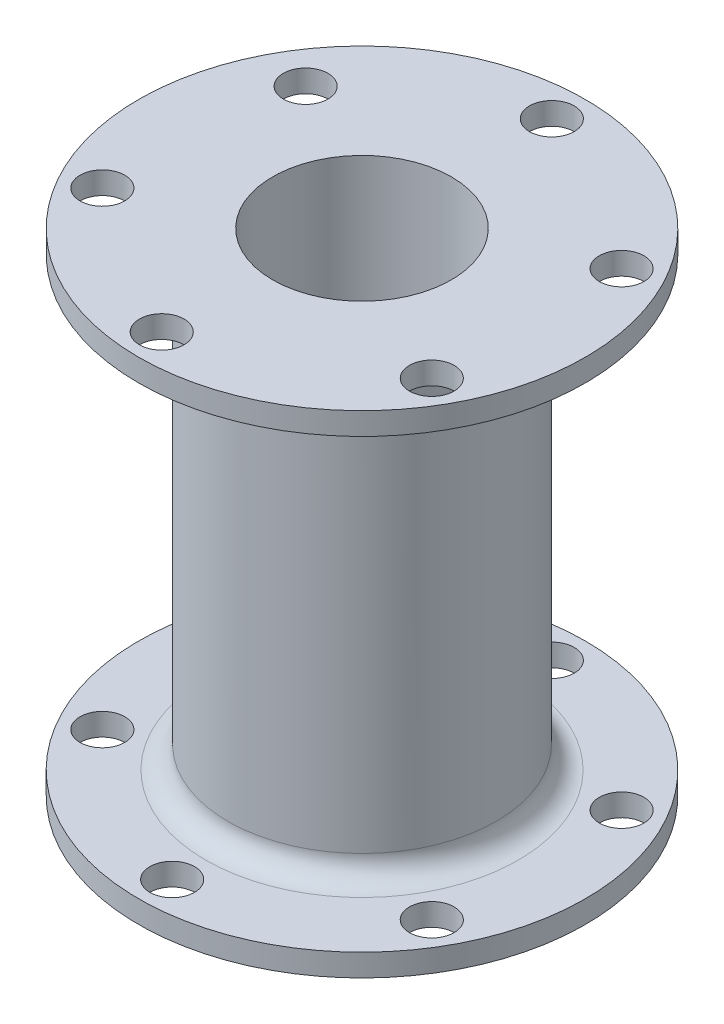
ISO-10303-21;
HEADER;
FILE_DESCRIPTION(('STEP AP214'),'2;1');
FILE_NAME('part.step','',(''),(''),'','','');
FILE_SCHEMA(('AUTOMOTIVE_DESIGN { 1 0 10303 214 1 1 1 1 }'));
ENDSEC;
DATA;
#1=APPLICATION_CONTEXT('core data for automotive mechanical design processes');
#2=APPLICATION_PROTOCOL_DEFINITION('international standard','automotive_design',2000,#1);
#3=PRODUCT_CONTEXT('',#1,'mechanical');
#4=PRODUCT('Part','Part','',(#3));
#5=PRODUCT_RELATED_PRODUCT_CATEGORY('part','',(#4));
#6=PRODUCT_DEFINITION_FORMATION('','',#4);
#7=PRODUCT_DEFINITION_CONTEXT('part definition',#1,'design');
#8=PRODUCT_DEFINITION('design','',#6,#7);
#9=PRODUCT_DEFINITION_SHAPE('','',#8);
#10=(LENGTH_UNIT() NAMED_UNIT(*) SI_UNIT(.MILLI.,.METRE.));
#11=(NAMED_UNIT(*) PLANE_ANGLE_UNIT() SI_UNIT($,.RADIAN.));
#12=(NAMED_UNIT(*) SI_UNIT($,.STERADIAN.) SOLID_ANGLE_UNIT());
#13=UNCERTAINTY_MEASURE_WITH_UNIT(LENGTH_MEASURE(1.E-05),#10,'distance_accuracy_value','');
#14=(GEOMETRIC_REPRESENTATION_CONTEXT(3) GLOBAL_UNCERTAINTY_ASSIGNED_CONTEXT((#13)) GLOBAL_UNIT_ASSIGNED_CONTEXT((#10,
#11,#12)) REPRESENTATION_CONTEXT('',''));
#15=CARTESIAN_POINT('',(0.,0.,0.));
#16=DIRECTION('',(0.,0.,1.));
#17=DIRECTION('',(1.,0.,0.));
#18=AXIS2_PLACEMENT_3D('',#15,#16,#17);
#19=CARTESIAN_POINT('',(0.,12.7,0.));
#20=DIRECTION('',(0.,1.,0.));
#21=DIRECTION('',(0.,0.,1.));
#22=AXIS2_PLACEMENT_3D('',#19,#20,#21);
#23=PLANE('',#22);
#24=CARTESIAN_POINT('',(0.,12.7,-107.95));
#25=DIRECTION('',(0.,1.,0.));
#26=DIRECTION('',(0.,0.,1.));
#27=AXIS2_PLACEMENT_3D('',#24,#25,#26);
#28=CIRCLE('',#27,12.7);
#29=CARTESIAN_POINT('',(0.,12.7,-95.25));
#30=VERTEX_POINT('',#29);
#31=EDGE_CURVE('E172',#30,#30,#28,.T.);
#32=ORIENTED_EDGE('',*,*,#31,.F.);
#33=EDGE_LOOP('',(#32));
#34=FACE_BOUND('',#33,.T.);
#35=CARTESIAN_POINT('',(93.6625,12.7,-53.975));
#36=DIRECTION('',(0.,1.,0.));
#37=DIRECTION('',(0.,0.,1.));
#38=AXIS2_PLACEMENT_3D('',#35,#36,#37);
#39=CIRCLE('',#38,12.7);
#40=CARTESIAN_POINT('',(93.6625,12.7,-41.275));
#41=VERTEX_POINT('',#40);
#42=EDGE_CURVE('E184',#41,#41,#39,.T.);
#43=ORIENTED_EDGE('',*,*,#42,.F.);
#44=EDGE_LOOP('',(#43));
#45=FACE_BOUND('',#44,.T.);
#46=CARTESIAN_POINT('',(-86.0203307345298,12.7,-53.975));
#47=DIRECTION('',(0.,1.,0.));
#48=DIRECTION('',(0.,0.,1.));
#49=AXIS2_PLACEMENT_3D('',#46,#47,#48);
#50=CIRCLE('',#49,12.7);
#51=CARTESIAN_POINT('',(-86.0203307345298,12.7,-41.275));
#52=VERTEX_POINT('',#51);
#53=EDGE_CURVE('E199',#52,#52,#50,.T.);
#54=ORIENTED_EDGE('',*,*,#53,.F.);
#55=EDGE_LOOP('',(#54));
#56=FACE_BOUND('',#55,.T.);
#57=CARTESIAN_POINT('',(-5.93227091070534,12.7,107.95));
#58=DIRECTION('',(0.,1.,0.));
#59=DIRECTION('',(0.,0.,1.));
#60=AXIS2_PLACEMENT_3D('',#57,#58,#59);
#61=CIRCLE('',#60,12.7);
#62=CARTESIAN_POINT('',(-5.93227091070534,12.7,120.65));
#63=VERTEX_POINT('',#62);
#64=EDGE_CURVE('E190',#63,#63,#61,.T.);
#65=ORIENTED_EDGE('',*,*,#64,.F.);
#66=EDGE_LOOP('',(#65));
#67=FACE_BOUND('',#66,.T.);
#68=CARTESIAN_POINT('',(-93.6625,12.7,53.975));
#69=DIRECTION('',(0.,1.,0.));
#70=DIRECTION('',(0.,0.,1.));
#71=AXIS2_PLACEMENT_3D('',#68,#69,#70);
#72=CIRCLE('',#71,12.7);
#73=CARTESIAN_POINT('',(-93.6625,12.7,66.675));
#74=VERTEX_POINT('',#73);
#75=EDGE_CURVE('E191',#74,#74,#72,.T.);
#76=ORIENTED_EDGE('',*,*,#75,.F.);
#77=EDGE_LOOP('',(#76));
#78=FACE_BOUND('',#77,.T.);
#79=CARTESIAN_POINT('',(93.6625,12.7,53.975));
#80=DIRECTION('',(0.,1.,0.));
#81=DIRECTION('',(0.,0.,1.));
#82=AXIS2_PLACEMENT_3D('',#79,#80,#81);
#83=CIRCLE('',#82,12.7);
#84=CARTESIAN_POINT('',(93.6625,12.7,66.675));
#85=VERTEX_POINT('',#84);
#86=EDGE_CURVE('E183',#85,#85,#83,.T.);
#87=ORIENTED_EDGE('',*,*,#86,.F.);
#88=EDGE_LOOP('',(#87));
#89=FACE_BOUND('',#88,.T.);
#90=CARTESIAN_POINT('',(0.,12.7,0.));
#91=DIRECTION('',(0.,1.,0.));
#92=DIRECTION('',(0.,0.,1.));
#93=AXIS2_PLACEMENT_3D('',#90,#91,#92);
#94=CIRCLE('',#93,127.);
#95=CARTESIAN_POINT('',(0.,12.7,127.));
#96=VERTEX_POINT('',#95);
#97=EDGE_CURVE('E83',#96,#96,#94,.T.);
#98=ORIENTED_EDGE('',*,*,#97,.T.);
#99=EDGE_LOOP('',(#98));
#100=FACE_BOUND('',#99,.T.);
#101=CARTESIAN_POINT('',(0.,12.7,0.));
#102=DIRECTION('',(0.,1.,0.));
#103=DIRECTION('',(0.,0.,1.));
#104=AXIS2_PLACEMENT_3D('',#101,#102,#103);
#105=CIRCLE('',#104,50.8);
#106=CARTESIAN_POINT('',(0.,12.7,50.8));
#107=VERTEX_POINT('',#106);
#108=EDGE_CURVE('E174',#107,#107,#105,.T.);
#109=ORIENTED_EDGE('',*,*,#108,.F.);
#110=EDGE_LOOP('',(#109));
#111=FACE_BOUND('',#110,.T.);
#112=ADVANCED_FACE('F41',(#34,#45,#56,#67,#78,#89,#100,#111),#23,.T.);
#113=CARTESIAN_POINT('',(0.,0.,0.));
#114=DIRECTION('',(0.,1.,0.));
#115=DIRECTION('',(0.,0.,1.));
#116=AXIS2_PLACEMENT_3D('',#113,#114,#115);
#117=PLANE('',#116);
#118=CARTESIAN_POINT('',(0.,0.,-107.95));
#119=DIRECTION('',(0.,1.,0.));
#120=DIRECTION('',(0.,0.,1.));
#121=AXIS2_PLACEMENT_3D('',#118,#119,#120);
#122=CIRCLE('',#121,12.7);
#123=CARTESIAN_POINT('',(0.,0.,-95.25));
#124=VERTEX_POINT('',#123);
#125=EDGE_CURVE('E170',#124,#124,#122,.T.);
#126=ORIENTED_EDGE('',*,*,#125,.T.);
#127=EDGE_LOOP('',(#126));
#128=FACE_BOUND('',#127,.T.);
#129=CARTESIAN_POINT('',(93.6625,0.,-53.975));
#130=DIRECTION('',(0.,1.,0.));
#131=DIRECTION('',(0.,0.,1.));
#132=AXIS2_PLACEMENT_3D('',#129,#130,#131);
#133=CIRCLE('',#132,12.7);
#134=CARTESIAN_POINT('',(93.6625,0.,-41.275));
#135=VERTEX_POINT('',#134);
#136=EDGE_CURVE('E180',#135,#135,#133,.T.);
#137=ORIENTED_EDGE('',*,*,#136,.T.);
#138=EDGE_LOOP('',(#137));
#139=FACE_BOUND('',#138,.T.);
#140=CARTESIAN_POINT('',(-86.0203307345298,0.,-53.975));
#141=DIRECTION('',(0.,1.,0.));
#142=DIRECTION('',(0.,0.,1.));
#143=AXIS2_PLACEMENT_3D('',#140,#141,#142);
#144=CIRCLE('',#143,12.7);
#145=CARTESIAN_POINT('',(-74.7494536763627,0.,-48.1220238049617));
#146=VERTEX_POINT('',#145);
#147=CARTESIAN_POINT('',(-75.8471951227985,0.,-46.3725456709477));
#148=VERTEX_POINT('',#147);
#149=EDGE_CURVE('E176',#146,#148,#144,.T.);
#150=ORIENTED_EDGE('',*,*,#149,.T.);
#151=CARTESIAN_POINT('',(0.,0.,0.));
#152=DIRECTION('',(0.,1.,0.));
#153=DIRECTION('',(0.,0.,1.));
#154=AXIS2_PLACEMENT_3D('',#151,#152,#153);
#155=CIRCLE('',#154,88.9);
#156=EDGE_CURVE('E55',#148,#146,#155,.T.);
#157=ORIENTED_EDGE('',*,*,#156,.T.);
#158=EDGE_LOOP('',(#150,#157));
#159=FACE_BOUND('',#158,.T.);
#160=CARTESIAN_POINT('',(-5.93227091070534,0.,107.95));
#161=DIRECTION('',(0.,1.,0.));
#162=DIRECTION('',(0.,0.,1.));
#163=AXIS2_PLACEMENT_3D('',#160,#161,#162);
#164=CIRCLE('',#163,12.7);
#165=CARTESIAN_POINT('',(-5.93227091070534,0.,120.65));
#166=VERTEX_POINT('',#165);
#167=EDGE_CURVE('E202',#166,#166,#164,.T.);
#168=ORIENTED_EDGE('',*,*,#167,.T.);
#169=EDGE_LOOP('',(#168));
#170=FACE_BOUND('',#169,.T.);
#171=CARTESIAN_POINT('',(-93.6625,0.,53.975));
#172=DIRECTION('',(0.,1.,0.));
#173=DIRECTION('',(0.,0.,1.));
#174=AXIS2_PLACEMENT_3D('',#171,#172,#173);
#175=CIRCLE('',#174,12.7);
#176=CARTESIAN_POINT('',(-93.6625,0.,66.675));
#177=VERTEX_POINT('',#176);
#178=EDGE_CURVE('E187',#177,#177,#175,.T.);
#179=ORIENTED_EDGE('',*,*,#178,.T.);
#180=EDGE_LOOP('',(#179));
#181=FACE_BOUND('',#180,.T.);
#182=CARTESIAN_POINT('',(93.6625,0.,53.975));
#183=DIRECTION('',(0.,1.,0.));
#184=DIRECTION('',(0.,0.,1.));
#185=AXIS2_PLACEMENT_3D('',#182,#183,#184);
#186=CIRCLE('',#185,12.7);
#187=CARTESIAN_POINT('',(93.6625,0.,66.675));
#188=VERTEX_POINT('',#187);
#189=EDGE_CURVE('E194',#188,#188,#186,.T.);
#190=ORIENTED_EDGE('',*,*,#189,.T.);
#191=EDGE_LOOP('',(#190));
#192=FACE_BOUND('',#191,.T.);
#193=CARTESIAN_POINT('',(0.,0.,0.));
#194=DIRECTION('',(0.,1.,0.));
#195=DIRECTION('',(0.,0.,1.));
#196=AXIS2_PLACEMENT_3D('',#193,#194,#195);
#197=CIRCLE('',#196,127.);
#198=CARTESIAN_POINT('',(0.,0.,127.));
#199=VERTEX_POINT('',#198);
#200=EDGE_CURVE('E209',#199,#199,#197,.T.);
#201=ORIENTED_EDGE('',*,*,#200,.F.);
#202=EDGE_LOOP('',(#201));
#203=FACE_BOUND('',#202,.T.);
#204=ADVANCED_FACE('F129',(#128,#139,#159,#170,#181,#192,#203),#117,.F.);
#205=CARTESIAN_POINT('',(0.,12.7,0.));
#206=DIRECTION('',(0.,-1.,0.));
#207=DIRECTION('',(0.,0.,-1.));
#208=AXIS2_PLACEMENT_3D('',#205,#206,#207);
#209=CYLINDRICAL_SURFACE('',#208,127.);
#210=ORIENTED_EDGE('',*,*,#97,.F.);
#211=EDGE_LOOP('',(#210));
#212=FACE_BOUND('',#211,.T.);
#213=ORIENTED_EDGE('',*,*,#200,.T.);
#214=EDGE_LOOP('',(#213));
#215=FACE_BOUND('',#214,.T.);
#216=ADVANCED_FACE('F101',(#212,#215),#209,.T.);
#217=CARTESIAN_POINT('',(0.,12.7,0.));
#218=DIRECTION('',(0.,-1.,0.));
#219=DIRECTION('',(0.,0.,-1.));
#220=AXIS2_PLACEMENT_3D('',#217,#218,#219);
#221=CYLINDRICAL_SURFACE('',#220,50.8);
#222=ORIENTED_EDGE('',*,*,#108,.T.);
#223=EDGE_LOOP('',(#222));
#224=FACE_BOUND('',#223,.T.);
#225=CARTESIAN_POINT('',(0.,-266.7,0.));
#226=DIRECTION('',(0.,-1.,0.));
#227=DIRECTION('',(0.,0.,-1.));
#228=AXIS2_PLACEMENT_3D('',#225,#226,#227);
#229=CIRCLE('',#228,50.8);
#230=CARTESIAN_POINT('',(0.,-266.7,-50.8));
#231=VERTEX_POINT('',#230);
#232=EDGE_CURVE('E226',#231,#231,#229,.T.);
#233=ORIENTED_EDGE('',*,*,#232,.T.);
#234=EDGE_LOOP('',(#233));
#235=FACE_BOUND('',#234,.T.);
#236=ADVANCED_FACE('F139',(#224,#235),#221,.F.);
#237=CARTESIAN_POINT('',(93.6625,0.,53.975));
#238=DIRECTION('',(0.,1.,0.));
#239=DIRECTION('',(0.,0.,1.));
#240=AXIS2_PLACEMENT_3D('',#237,#238,#239);
#241=CYLINDRICAL_SURFACE('',#240,12.7);
#242=ORIENTED_EDGE('',*,*,#189,.F.);
#243=EDGE_LOOP('',(#242));
#244=FACE_BOUND('',#243,.T.);
#245=ORIENTED_EDGE('',*,*,#86,.T.);
#246=EDGE_LOOP('',(#245));
#247=FACE_BOUND('',#246,.T.);
#248=ADVANCED_FACE('F143',(#244,#247),#241,.F.);
#249=CARTESIAN_POINT('',(-93.6625,0.,53.975));
#250=DIRECTION('',(0.,1.,0.));
#251=DIRECTION('',(0.,0.,1.));
#252=AXIS2_PLACEMENT_3D('',#249,#250,#251);
#253=CYLINDRICAL_SURFACE('',#252,12.7);
#254=ORIENTED_EDGE('',*,*,#178,.F.);
#255=EDGE_LOOP('',(#254));
#256=FACE_BOUND('',#255,.T.);
#257=ORIENTED_EDGE('',*,*,#75,.T.);
#258=EDGE_LOOP('',(#257));
#259=FACE_BOUND('',#258,.T.);
#260=ADVANCED_FACE('F148',(#256,#259),#253,.F.);
#261=CARTESIAN_POINT('',(-5.93227091070534,0.,107.95));
#262=DIRECTION('',(0.,1.,0.));
#263=DIRECTION('',(0.,0.,1.));
#264=AXIS2_PLACEMENT_3D('',#261,#262,#263);
#265=CYLINDRICAL_SURFACE('',#264,12.7);
#266=ORIENTED_EDGE('',*,*,#167,.F.);
#267=EDGE_LOOP('',(#266));
#268=FACE_BOUND('',#267,.T.);
#269=ORIENTED_EDGE('',*,*,#64,.T.);
#270=EDGE_LOOP('',(#269));
#271=FACE_BOUND('',#270,.T.);
#272=ADVANCED_FACE('F145',(#268,#271),#265,.F.);
#273=CARTESIAN_POINT('',(-86.0203307345298,0.,-53.975));
#274=DIRECTION('',(0.,1.,0.));
#275=DIRECTION('',(0.,0.,1.));
#276=AXIS2_PLACEMENT_3D('',#273,#274,#275);
#277=CYLINDRICAL_SURFACE('',#276,12.7);
#278=EDGE_CURVE('E76',#148,#146,#144,.T.);
#279=ORIENTED_EDGE('',*,*,#278,.F.);
#280=ORIENTED_EDGE('',*,*,#149,.F.);
#281=EDGE_LOOP('',(#279,#280));
#282=FACE_BOUND('',#281,.T.);
#283=ORIENTED_EDGE('',*,*,#53,.T.);
#284=EDGE_LOOP('',(#283));
#285=FACE_BOUND('',#284,.T.);
#286=ADVANCED_FACE('F147',(#282,#285),#277,.F.);
#287=CARTESIAN_POINT('',(93.6625,0.,-53.975));
#288=DIRECTION('',(0.,1.,0.));
#289=DIRECTION('',(0.,0.,1.));
#290=AXIS2_PLACEMENT_3D('',#287,#288,#289);
#291=CYLINDRICAL_SURFACE('',#290,12.7);
#292=ORIENTED_EDGE('',*,*,#136,.F.);
#293=EDGE_LOOP('',(#292));
#294=FACE_BOUND('',#293,.T.);
#295=ORIENTED_EDGE('',*,*,#42,.T.);
#296=EDGE_LOOP('',(#295));
#297=FACE_BOUND('',#296,.T.);
#298=ADVANCED_FACE('F153',(#294,#297),#291,.F.);
#299=CARTESIAN_POINT('',(0.,0.,-107.95));
#300=DIRECTION('',(0.,1.,0.));
#301=DIRECTION('',(0.,0.,1.));
#302=AXIS2_PLACEMENT_3D('',#299,#300,#301);
#303=CYLINDRICAL_SURFACE('',#302,12.7);
#304=ORIENTED_EDGE('',*,*,#125,.F.);
#305=EDGE_LOOP('',(#304));
#306=FACE_BOUND('',#305,.T.);
#307=ORIENTED_EDGE('',*,*,#31,.T.);
#308=EDGE_LOOP('',(#307));
#309=FACE_BOUND('',#308,.T.);
#310=ADVANCED_FACE('F126',(#306,#309),#303,.F.);
#311=CARTESIAN_POINT('',(0.,-254.,0.));
#312=DIRECTION('',(0.,1.,0.));
#313=DIRECTION('',(0.,0.,1.));
#314=AXIS2_PLACEMENT_3D('',#311,#312,#313);
#315=CYLINDRICAL_SURFACE('',#314,76.2);
#316=CARTESIAN_POINT('',(0.,-241.3,0.));
#317=DIRECTION('',(0.,-1.,0.));
#318=DIRECTION('',(0.,0.,-1.));
#319=AXIS2_PLACEMENT_3D('',#316,#317,#318);
#320=CIRCLE('',#319,76.2);
#321=CARTESIAN_POINT('',(0.,-241.3,-76.2));
#322=VERTEX_POINT('',#321);
#323=EDGE_CURVE('E12',#322,#322,#320,.F.);
#324=ORIENTED_EDGE('',*,*,#323,.T.);
#325=EDGE_LOOP('',(#324));
#326=FACE_BOUND('',#325,.T.);
#327=CARTESIAN_POINT('',(0.,-12.7,0.));
#328=DIRECTION('',(0.,1.,0.));
#329=DIRECTION('',(0.,0.,1.));
#330=AXIS2_PLACEMENT_3D('',#327,#328,#329);
#331=CIRCLE('',#330,76.2);
#332=CARTESIAN_POINT('',(-64.0709602940252,-12.7,-41.2474489756815));
#333=VERTEX_POINT('',#332);
#334=CARTESIAN_POINT('',(-65.0118815338273,-12.7,-39.7478962893838));
#335=VERTEX_POINT('',#334);
#336=EDGE_CURVE('E80',#333,#335,#331,.F.);
#337=ORIENTED_EDGE('',*,*,#336,.T.);
#338=CARTESIAN_POINT('',(-66.3922054172742,-12.6790344130905,-37.3967252554346));
#339=CARTESIAN_POINT('',(-66.2566760114508,0.718416275781455,-37.637337129604));
#340=CARTESIAN_POINT('',(-77.9226732737142,0.,-44.1914452448357));
#341=CARTESIAN_POINT('',(-66.3363018171941,-12.6817729086105,-37.4959736277565));
#342=CARTESIAN_POINT('',(-66.2135987618936,0.672224703842054,-37.7129761954845));
#343=CARTESIAN_POINT('',(-77.8322874908656,0.,-44.2662532685392));
#344=CARTESIAN_POINT('',(-66.2801727097247,-12.6841292861744,-37.5951018579314));
#345=CARTESIAN_POINT('',(-66.1691145303424,0.627741419865773,-37.790832487182));
#346=CARTESIAN_POINT('',(-77.7418888755431,0.,-44.3431881989159));
#347=CARTESIAN_POINT('',(-66.1674667495949,-12.6881993651497,-37.7931120859876));
#348=CARTESIAN_POINT('',(-66.0776409840994,0.542600586077002,-37.9503113353694));
#349=CARTESIAN_POINT('',(-77.5614127441039,0.,-44.5012946588715));
#350=CARTESIAN_POINT('',(-66.1108899009723,-12.6899130723502,-37.8919940860789));
#351=CARTESIAN_POINT('',(-66.0306485348425,0.501920331039952,-38.0319412888461));
#352=CARTESIAN_POINT('',(-77.4713352251022,0.,-44.5824661502805));
#353=CARTESIAN_POINT('',(-65.9404949447733,-12.6942724892202,-38.1882578669827));
#354=CARTESIAN_POINT('',(-65.8863429733826,0.386091425728664,-38.2815502374763));
#355=CARTESIAN_POINT('',(-77.2021080279843,0.,-44.8323061324113));
#356=CARTESIAN_POINT('',(-65.8260086727109,-12.6961366617123,-38.385264093375));
#357=CARTESIAN_POINT('',(-65.7852373693161,0.316679555883295,-38.4550633598136));
#358=CARTESIAN_POINT('',(-77.0239575941263,0.,-45.0073051564307));
#359=CARTESIAN_POINT('',(-65.5952933710487,-12.6986285437142,-38.7782076346673));
#360=CARTESIAN_POINT('',(-65.5750756853083,0.195339026706855,-38.8122837108383));
#361=CARTESIAN_POINT('',(-76.6732914294015,0.,-45.3734256538379));
#362=CARTESIAN_POINT('',(-65.4790646713201,-12.6992564843582,-38.9741451425491));
#363=CARTESIAN_POINT('',(-65.4659284691607,0.143250680050112,-38.9961619494216));
#364=CARTESIAN_POINT('',(-76.500774651162,0.,-45.5645441064609));
#365=CARTESIAN_POINT('',(-65.2448533321656,-12.6999429224291,-39.364971917946));
#366=CARTESIAN_POINT('',(-65.2413845645419,0.0574434129555664,-39.3706640270329));
#367=CARTESIAN_POINT('',(-76.1642981682024,0.,-45.9614927762687));
#368=CARTESIAN_POINT('',(-65.1268706777553,-12.7000014149883,-39.5598611764864));
#369=CARTESIAN_POINT('',(-65.1258546883355,0.0236044005259853,-39.561522260085));
#370=CARTESIAN_POINT('',(-76.0003385366412,0.,-46.1673231191963));
#371=CARTESIAN_POINT('',(-64.8893983223144,-12.699998539859,-39.9481874444302));
#372=CARTESIAN_POINT('',(-64.8907142952889,-0.025101505925123,-39.9460358120175));
#373=CARTESIAN_POINT('',(-75.6840660212888,0.,-46.5911396022112));
#374=CARTESIAN_POINT('',(-64.7699120810946,-12.6999374100713,-40.1416265698233));
#375=CARTESIAN_POINT('',(-64.7709493748268,-0.0400775229843868,-40.1399587063546));
#376=CARTESIAN_POINT('',(-75.5317306455671,0.,-46.8091007794003));
#377=CARTESIAN_POINT('',(-64.5292132664934,-12.6998981363971,-40.5274268791216));
#378=CARTESIAN_POINT('',(-64.5292214404825,-0.0509739250586011,-40.527419028813));
#379=CARTESIAN_POINT('',(-75.2407156894592,0.,-47.2548261611453));
#380=CARTESIAN_POINT('',(-64.4080006990769,-12.6999199922239,-40.7197880667483));
#381=CARTESIAN_POINT('',(-64.4070776089387,-0.0469107733609275,-40.721247981808));
#382=CARTESIAN_POINT('',(-75.1020360619011,0.,-47.4825903318341));
#383=CARTESIAN_POINT('',(-64.1638368989692,-12.6999915259115,-41.1034517656081));
#384=CARTESIAN_POINT('',(-64.1627921085284,-0.0198544392725567,-41.1050840430494));
#385=CARTESIAN_POINT('',(-74.840111677896,0.,-47.9448024730881));
#386=CARTESIAN_POINT('',(-64.0408853615236,-12.7000412087094,-41.294754082892));
#387=CARTESIAN_POINT('',(-64.0404678551706,0.00318258108777111,-41.2953732755222));
#388=CARTESIAN_POINT('',(-74.7168696651448,0.,-48.1792516226969));
#389=CARTESIAN_POINT('',(-63.7932740463723,-12.6998590796836,-41.6762510241735));
#390=CARTESIAN_POINT('',(-63.7981359808467,0.0677329803441533,-41.6687843230006));
#391=CARTESIAN_POINT('',(-74.4869721055512,0.,-48.6514108941366));
#392=CARTESIAN_POINT('',(-63.6686142623808,-12.6996272668239,-41.8664456440914));
#393=CARTESIAN_POINT('',(-63.6779605638811,0.10933965462767,-41.8521555387905));
#394=CARTESIAN_POINT('',(-74.3803166197597,0.,-48.8891210279669));
#395=CARTESIAN_POINT('',(-63.4174026794564,-12.6983380926377,-42.2460046708477));
#396=CARTESIAN_POINT('',(-63.4420525066568,0.21032300017279,-42.2089304847803));
#397=CARTESIAN_POINT('',(-74.1838468846344,0.,-49.3647950440976));
#398=CARTESIAN_POINT('',(-63.2908482435028,-12.697279450135,-42.4353673302403));
#399=CARTESIAN_POINT('',(-63.3261893744829,0.269863933427487,-42.3825136631104));
#400=CARTESIAN_POINT('',(-74.0940590398643,0.,-49.6027587473585));
#401=CARTESIAN_POINT('',(-63.0360515893977,-12.693588039505,-42.8129427914761));
#402=CARTESIAN_POINT('',(-63.1013920282846,0.405573993398289,-42.7166019980957));
#403=CARTESIAN_POINT('',(-73.9312604763514,0.,-50.0754004123108));
#404=CARTESIAN_POINT('',(-62.9078093791008,-12.6909552787008,-43.0011555986646));
#405=CARTESIAN_POINT('',(-62.9923614492995,0.481910226201257,-42.8772358165688));
#406=CARTESIAN_POINT('',(-73.8582496795608,0.,-50.3100783892829));
#407=CARTESIAN_POINT('',(-62.6497087097746,-12.6832100255491,-43.3763278757359));
#408=CARTESIAN_POINT('',(-62.7834806328776,0.649728203162697,-43.1829003653382));
#409=CARTESIAN_POINT('',(-73.7281856407773,0.,-50.7732758897234));
#410=CARTESIAN_POINT('',(-62.5198508953586,-12.6780984931342,-43.5632878024192));
#411=CARTESIAN_POINT('',(-62.6835802435787,0.741385245491094,-43.3279914822407));
#412=CARTESIAN_POINT('',(-73.6711262349008,0.,-51.0017977610821));
#413=CARTESIAN_POINT('',(-62.2585105061954,-12.6643746149944,-43.9359723427));
#414=CARTESIAN_POINT('',(-62.49500732905,0.938078425492645,-43.6005392264234));
#415=CARTESIAN_POINT('',(-73.5716522165493,0.,-51.4504756320254));
#416=CARTESIAN_POINT('',(-62.1270279668431,-12.6557623454043,-44.1216969830735));
#417=CARTESIAN_POINT('',(-62.4063410320817,1.04329238182593,-43.7279765185214));
#418=CARTESIAN_POINT('',(-73.5292372856207,0.,-51.6706318134346));
#419=CARTESIAN_POINT('',(-61.8621882686278,-12.6339166711158,-44.4922649956994));
#420=CARTESIAN_POINT('',(-62.2419837175014,1.26523543062939,-43.9637803266469));
#421=CARTESIAN_POINT('',(-73.4574065623682,0.,-52.101306267635));
#422=CARTESIAN_POINT('',(-61.7288274607604,-12.6206725642652,-44.6771053133056));
#423=CARTESIAN_POINT('',(-62.1663830224511,1.38214886449496,-44.0720124556416));
#424=CARTESIAN_POINT('',(-73.4280212354787,0.,-52.311800931576));
#425=CARTESIAN_POINT('',(-61.4606380058068,-12.5884320806784,-45.0453311118222));
#426=CARTESIAN_POINT('',(-62.0301678546982,1.6247945146641,-44.2677273730166));
#427=CARTESIAN_POINT('',(-73.380680413367,0.,-52.7213165491197));
#428=CARTESIAN_POINT('',(-61.325809480377,-12.5694361772502,-45.2287167111658));
#429=CARTESIAN_POINT('',(-61.9696562545399,1.75065352702715,-44.3550691888732));
#430=CARTESIAN_POINT('',(-73.3627239780527,0.,-52.9203384451985));
#431=CARTESIAN_POINT('',(-61.0546041000969,-12.5245170103327,-45.5941569050581));
#432=CARTESIAN_POINT('',(-61.8650732324829,2.0085870094861,-44.5082244325447));
#433=CARTESIAN_POINT('',(-73.336463041411,0.,-53.3063876445321));
#434=CARTESIAN_POINT('',(-60.9182252244641,-12.4985833886169,-45.7762090877635));
#435=CARTESIAN_POINT('',(-61.8211694933337,2.14075241797551,-44.5738197804027));
#436=CARTESIAN_POINT('',(-73.3281730724108,0.,-53.4933964899038));
#437=CARTESIAN_POINT('',(-60.6442782743348,-12.438688822414,-46.1385217401014));
#438=CARTESIAN_POINT('',(-61.751046030997,2.40807280162599,-44.6830293252913));
#439=CARTESIAN_POINT('',(-73.3196185970241,0.,-53.8548034995682));
#440=CARTESIAN_POINT('',(-60.5067098474033,-12.4047254145015,-46.3187816421677));
#441=CARTESIAN_POINT('',(-61.7249991882143,2.54326153794241,-44.7264289908912));
#442=CARTESIAN_POINT('',(-73.319356556721,0.,-54.0291977724029));
#443=CARTESIAN_POINT('',(-60.3686684937837,-12.3661980995886,-46.497998497652));
#444=CARTESIAN_POINT('',(-61.7085072536678,2.6775757337174,-44.7584767000708));
#445=CARTESIAN_POINT('',(-73.32227263801,0.,-54.1970823662734));
#446=(BOUNDED_SURFACE() B_SPLINE_SURFACE(3,2,((#338,#339,#340),(#341,#342,#343),(#344,#345,
#346),(#347,#348,#349),(#350,#351,#352),(#353,#354,#355),(#356,#357,#358),(#359,#360,#361),
(#362,#363,#364),(#365,#366,#367),(#368,#369,#370),(#371,#372,#373),(#374,#375,#376),(#377,#378,
#379),(#380,#381,#382),(#383,#384,#385),(#386,#387,#388),(#389,#390,#391),(#392,#393,#394),
(#395,#396,#397),(#398,#399,#400),(#401,#402,#403),(#404,#405,#406),(#407,#408,#409),(#410,#411,
#412),(#413,#414,#415),(#416,#417,#418),(#419,#420,#421),(#422,#423,#424),(#425,#426,#427),
(#428,#429,#430),(#431,#432,#433),(#434,#435,#436),(#437,#438,#439),(#440,#441,#442),(#443,#444,
#445)),.UNSPECIFIED.,.F.,.F.,.F.) B_SPLINE_SURFACE_WITH_KNOTS((4,2,2,2,2,2,2,2,2,2,2,2,2,2,2,2,
2,4),(3,3),(0.,0.398766810973357,0.797530029812604,1.59502969132979,2.39238023286556,
3.18973759018299,3.98551080271007,4.78128126624677,5.57719296038227,6.37310758399984,
7.17025793352929,7.96740457459227,8.76424275776546,9.56106361208938,10.3597378694007,
11.1583464226684,11.9581540427078,12.7582073516036),(0.,1.),
.UNSPECIFIED.) GEOMETRIC_REPRESENTATION_ITEM() RATIONAL_B_SPLINE_SURFACE(((1.,0.68788685239758,
1.),(1.,0.689078699923159,1.),(1.,0.69023238200927,1.),(1.,0.692454913334502,1.),(1.,
0.693523763337712,1.),(1.,0.696590275154338,1.),(1.,0.698447979944379,1.),(1.,0.701728348771315,
1.),(1.,0.703151094089086,1.),(1.,0.705512051005873,1.),(1.,0.706450258462974,1.),(1.,
0.707806283598112,1.),(1.,0.708225131454073,1.),(1.,0.708530115858395,1.),(1.,0.708416254246997,
1.),(1.,0.707660057406695,1.),(1.,0.707017628389701,1.),(1.,0.705228110516131,1.),(1.,
0.704081019802081,1.),(1.,0.701321345895517,1.),(1.,0.699708042750981,1.),(1.,0.696071962471053,
1.),(1.,0.694049187240633,1.),(1.,0.689659771120871,1.),(1.,0.687293263594082,1.),(1.,
0.682285576658693,1.),(1.,0.679644403224506,1.),(1.,0.674151853582191,1.),(1.,0.671300002732465,
1.),(1.,0.66546101501484,1.),(1.,0.662473889295735,1.),(1.,0.656424982928008,1.),(1.,
0.653363096923109,1.),(1.,0.647226010309756,1.),(1.,0.644150805900183,1.),(1.,0.641098416263758,1.))) REPRESENTATION_ITEM('') SURFACE());
#447=CARTESIAN_POINT('',(-66.3922054172742,-12.6790344130905,-37.3967252554346));
#448=CARTESIAN_POINT('',(-66.3363018171941,-12.6817729086105,-37.4959736277565));
#449=CARTESIAN_POINT('',(-66.2801727097247,-12.6841292861744,-37.5951018579314));
#450=CARTESIAN_POINT('',(-66.1674667495949,-12.6881993651497,-37.7931120859876));
#451=CARTESIAN_POINT('',(-66.1108899009723,-12.6899130723502,-37.8919940860789));
#452=CARTESIAN_POINT('',(-65.9404949447733,-12.6942724892202,-38.1882578669827));
#453=CARTESIAN_POINT('',(-65.8260086727109,-12.6961366617123,-38.385264093375));
#454=CARTESIAN_POINT('',(-65.5952933710487,-12.6986285437142,-38.7782076346673));
#455=CARTESIAN_POINT('',(-65.4790646713201,-12.6992564843582,-38.9741451425491));
#456=CARTESIAN_POINT('',(-65.2448533321655,-12.6999429224291,-39.364971917946));
#457=CARTESIAN_POINT('',(-65.1268706777553,-12.7000014149883,-39.5598611764864));
#458=CARTESIAN_POINT('',(-64.8893983223144,-12.699998539859,-39.9481874444302));
#459=CARTESIAN_POINT('',(-64.7699120810946,-12.6999374100713,-40.1416265698233));
#460=CARTESIAN_POINT('',(-64.5292132664934,-12.6998981363971,-40.5274268791216));
#461=CARTESIAN_POINT('',(-64.4080006990769,-12.6999199922239,-40.7197880667483));
#462=CARTESIAN_POINT('',(-64.1638368989692,-12.6999915259115,-41.1034517656081));
#463=CARTESIAN_POINT('',(-64.0408853615236,-12.7000412087094,-41.294754082892));
#464=CARTESIAN_POINT('',(-63.7932740463723,-12.6998590796836,-41.6762510241735));
#465=CARTESIAN_POINT('',(-63.6686142623808,-12.6996272668239,-41.8664456440914));
#466=CARTESIAN_POINT('',(-63.4174026794564,-12.6983380926377,-42.2460046708477));
#467=CARTESIAN_POINT('',(-63.2908482435028,-12.697279450135,-42.4353673302403));
#468=CARTESIAN_POINT('',(-63.0360515893977,-12.693588039505,-42.8129427914761));
#469=CARTESIAN_POINT('',(-62.9078093791008,-12.6909552787008,-43.0011555986646));
#470=CARTESIAN_POINT('',(-62.6497087097746,-12.6832100255491,-43.3763278757359));
#471=CARTESIAN_POINT('',(-62.5198508953586,-12.6780984931342,-43.5632878024192));
#472=CARTESIAN_POINT('',(-62.2585105061954,-12.6643746149944,-43.9359723427));
#473=CARTESIAN_POINT('',(-62.1270279668431,-12.6557623454043,-44.1216969830735));
#474=CARTESIAN_POINT('',(-61.8621882686278,-12.6339166711158,-44.4922649956994));
#475=CARTESIAN_POINT('',(-61.7288274607604,-12.6206725642652,-44.6771053133056));
#476=CARTESIAN_POINT('',(-61.4606380058068,-12.5884320806784,-45.0453311118222));
#477=CARTESIAN_POINT('',(-61.325809480377,-12.5694361772502,-45.2287167111658));
#478=CARTESIAN_POINT('',(-61.0546041000969,-12.5245170103327,-45.5941569050581));
#479=CARTESIAN_POINT('',(-60.9182252244641,-12.4985833886169,-45.7762090877635));
#480=CARTESIAN_POINT('',(-60.6442782743348,-12.438688822414,-46.1385217401014));
#481=CARTESIAN_POINT('',(-60.5067098474033,-12.4047254145015,-46.3187816421677));
#482=CARTESIAN_POINT('',(-60.3686684937837,-12.3661980995886,-46.497998497652));
#483=B_SPLINE_CURVE_WITH_KNOTS('',3,(#447,#448,#449,#450,#451,#452,#453,#454,#455,#456,#457,
#458,#459,#460,#461,#462,#463,#464,#465,#466,#467,#468,#469,#470,#471,#472,#473,#474,#475,#476,
#477,#478,#479,#480,#481,#482),.UNSPECIFIED.,.F.,.F.,(4,2,2,2,2,2,2,2,2,2,2,2,2,2,2,2,2,4),(0.,
0.398766810973357,0.797530029812604,1.59502969132979,2.39238023286556,3.18973759018299,
3.98551080271007,4.78128126624677,5.57719296038227,6.37310758399984,7.17025793352929,
7.96740457459227,8.76424275776546,9.56106361208938,10.3597378694007,11.1583464226684,
11.9581540427078,12.7582073516036),.UNSPECIFIED.);
#484=EDGE_CURVE('E74',#335,#333,#483,.T.);
#485=ORIENTED_EDGE('',*,*,#484,.T.);
#486=EDGE_LOOP('',(#337,#485));
#487=FACE_BOUND('',#486,.T.);
#488=ADVANCED_FACE('F85',(#326,#487),#315,.T.);
#489=CARTESIAN_POINT('',(0.,-12.7,0.));
#490=DIRECTION('',(0.,1.,0.));
#491=DIRECTION('',(0.,0.,1.));
#492=AXIS2_PLACEMENT_3D('',#489,#490,#491);
#493=TOROIDAL_SURFACE('',#492,88.9,12.7);
#494=CARTESIAN_POINT('',(-74.7494536763627,-12.7,-48.1220238049617));
#495=DIRECTION('',(0.541305104667736,0.,-0.840826250577759));
#496=DIRECTION('',(-0.840826250577759,0.,-0.541305104667736));
#497=AXIS2_PLACEMENT_3D('',#494,#495,#496);
#498=CIRCLE('',#497,12.7);
#499=EDGE_CURVE('E70',#146,#333,#498,.T.);
#500=ORIENTED_EDGE('',*,*,#499,.F.);
#501=ORIENTED_EDGE('',*,*,#156,.F.);
#502=CARTESIAN_POINT('',(-75.8471951227985,-12.7,-46.3725456709477));
#503=DIRECTION('',(-0.521625935556217,0.,0.85317429834419));
#504=DIRECTION('',(0.85317429834419,0.,0.521625935556217));
#505=AXIS2_PLACEMENT_3D('',#502,#503,#504);
#506=CIRCLE('',#505,12.7);
#507=EDGE_CURVE('E63',#335,#148,#506,.T.);
#508=ORIENTED_EDGE('',*,*,#507,.F.);
#509=ORIENTED_EDGE('',*,*,#336,.F.);
#510=EDGE_LOOP('',(#500,#501,#508,#509));
#511=FACE_BOUND('',#510,.T.);
#512=ADVANCED_FACE('F81',(#511),#493,.F.);
#513=ORIENTED_EDGE('',*,*,#507,.T.);
#514=ORIENTED_EDGE('',*,*,#278,.T.);
#515=ORIENTED_EDGE('',*,*,#499,.T.);
#516=ORIENTED_EDGE('',*,*,#484,.F.);
#517=EDGE_LOOP('',(#513,#514,#515,#516));
#518=FACE_BOUND('',#517,.T.);
#519=ADVANCED_FACE('F72',(#518),#446,.F.);
#520=CARTESIAN_POINT('',(0.,-254.,0.));
#521=DIRECTION('',(0.,-1.,0.));
#522=DIRECTION('',(0.,0.,-1.));
#523=AXIS2_PLACEMENT_3D('',#520,#521,#522);
#524=PLANE('',#523);
#525=CARTESIAN_POINT('',(0.,-254.,0.));
#526=DIRECTION('',(0.,-1.,0.));
#527=DIRECTION('',(0.,0.,-1.));
#528=AXIS2_PLACEMENT_3D('',#525,#526,#527);
#529=CIRCLE('',#528,88.9);
#530=CARTESIAN_POINT('',(0.,-254.,-88.9));
#531=VERTEX_POINT('',#530);
#532=EDGE_CURVE('E49',#531,#531,#529,.T.);
#533=ORIENTED_EDGE('',*,*,#532,.T.);
#534=EDGE_LOOP('',(#533));
#535=FACE_BOUND('',#534,.T.);
#536=CARTESIAN_POINT('',(0.,-254.,107.95));
#537=DIRECTION('',(0.,-1.,0.));
#538=DIRECTION('',(0.,0.,-1.));
#539=AXIS2_PLACEMENT_3D('',#536,#537,#538);
#540=CIRCLE('',#539,12.7);
#541=CARTESIAN_POINT('',(0.,-254.,95.25));
#542=VERTEX_POINT('',#541);
#543=EDGE_CURVE('E229',#542,#542,#540,.T.);
#544=ORIENTED_EDGE('',*,*,#543,.T.);
#545=EDGE_LOOP('',(#544));
#546=FACE_BOUND('',#545,.T.);
#547=CARTESIAN_POINT('',(-93.6625,-254.,-53.975));
#548=DIRECTION('',(0.,-1.,0.));
#549=DIRECTION('',(0.,0.,-1.));
#550=AXIS2_PLACEMENT_3D('',#547,#548,#549);
#551=CIRCLE('',#550,12.7);
#552=CARTESIAN_POINT('',(-93.6625,-254.,-66.675));
#553=VERTEX_POINT('',#552);
#554=EDGE_CURVE('E297',#553,#553,#551,.T.);
#555=ORIENTED_EDGE('',*,*,#554,.T.);
#556=EDGE_LOOP('',(#555));
#557=FACE_BOUND('',#556,.T.);
#558=CARTESIAN_POINT('',(-93.6625,-254.,53.975));
#559=DIRECTION('',(0.,-1.,0.));
#560=DIRECTION('',(0.,0.,-1.));
#561=AXIS2_PLACEMENT_3D('',#558,#559,#560);
#562=CIRCLE('',#561,12.7);
#563=CARTESIAN_POINT('',(-93.6625,-254.,41.275));
#564=VERTEX_POINT('',#563);
#565=EDGE_CURVE('E316',#564,#564,#562,.T.);
#566=ORIENTED_EDGE('',*,*,#565,.T.);
#567=EDGE_LOOP('',(#566));
#568=FACE_BOUND('',#567,.T.);
#569=CARTESIAN_POINT('',(93.6625,-254.,53.975));
#570=DIRECTION('',(0.,-1.,0.));
#571=DIRECTION('',(0.,0.,-1.));
#572=AXIS2_PLACEMENT_3D('',#569,#570,#571);
#573=CIRCLE('',#572,12.7);
#574=CARTESIAN_POINT('',(93.6625,-254.,41.275));
#575=VERTEX_POINT('',#574);
#576=EDGE_CURVE('E311',#575,#575,#573,.T.);
#577=ORIENTED_EDGE('',*,*,#576,.T.);
#578=EDGE_LOOP('',(#577));
#579=FACE_BOUND('',#578,.T.);
#580=CARTESIAN_POINT('',(93.6625,-254.,-53.975));
#581=DIRECTION('',(0.,-1.,0.));
#582=DIRECTION('',(0.,0.,-1.));
#583=AXIS2_PLACEMENT_3D('',#580,#581,#582);
#584=CIRCLE('',#583,12.7);
#585=CARTESIAN_POINT('',(93.6625,-254.,-66.675));
#586=VERTEX_POINT('',#585);
#587=EDGE_CURVE('E305',#586,#586,#584,.T.);
#588=ORIENTED_EDGE('',*,*,#587,.T.);
#589=EDGE_LOOP('',(#588));
#590=FACE_BOUND('',#589,.T.);
#591=CARTESIAN_POINT('',(0.,-254.,-107.95));
#592=DIRECTION('',(0.,-1.,0.));
#593=DIRECTION('',(0.,0.,-1.));
#594=AXIS2_PLACEMENT_3D('',#591,#592,#593);
#595=CIRCLE('',#594,12.7);
#596=CARTESIAN_POINT('',(0.,-254.,-120.65));
#597=VERTEX_POINT('',#596);
#598=EDGE_CURVE('E291',#597,#597,#595,.T.);
#599=ORIENTED_EDGE('',*,*,#598,.T.);
#600=EDGE_LOOP('',(#599));
#601=FACE_BOUND('',#600,.T.);
#602=CARTESIAN_POINT('',(0.,-254.,0.));
#603=DIRECTION('',(0.,-1.,0.));
#604=DIRECTION('',(0.,0.,-1.));
#605=AXIS2_PLACEMENT_3D('',#602,#603,#604);
#606=CIRCLE('',#605,127.);
#607=CARTESIAN_POINT('',(0.,-254.,-127.));
#608=VERTEX_POINT('',#607);
#609=EDGE_CURVE('E228',#608,#608,#606,.T.);
#610=ORIENTED_EDGE('',*,*,#609,.F.);
#611=EDGE_LOOP('',(#610));
#612=FACE_BOUND('',#611,.T.);
#613=ADVANCED_FACE('F107',(#535,#546,#557,#568,#579,#590,#601,#612),#524,.F.);
#614=CARTESIAN_POINT('',(0.,-266.7,0.));
#615=DIRECTION('',(0.,-1.,0.));
#616=DIRECTION('',(0.,0.,-1.));
#617=AXIS2_PLACEMENT_3D('',#614,#615,#616);
#618=PLANE('',#617);
#619=CARTESIAN_POINT('',(0.,-266.7,107.95));
#620=DIRECTION('',(0.,-1.,0.));
#621=DIRECTION('',(0.,0.,-1.));
#622=AXIS2_PLACEMENT_3D('',#619,#620,#621);
#623=CIRCLE('',#622,12.7);
#624=CARTESIAN_POINT('',(0.,-266.7,95.25));
#625=VERTEX_POINT('',#624);
#626=EDGE_CURVE('E233',#625,#625,#623,.T.);
#627=ORIENTED_EDGE('',*,*,#626,.F.);
#628=EDGE_LOOP('',(#627));
#629=FACE_BOUND('',#628,.T.);
#630=CARTESIAN_POINT('',(-93.6625,-266.7,-53.975));
#631=DIRECTION('',(0.,-1.,0.));
#632=DIRECTION('',(0.,0.,-1.));
#633=AXIS2_PLACEMENT_3D('',#630,#631,#632);
#634=CIRCLE('',#633,12.7);
#635=CARTESIAN_POINT('',(-93.6625,-266.7,-66.675));
#636=VERTEX_POINT('',#635);
#637=EDGE_CURVE('E300',#636,#636,#634,.T.);
#638=ORIENTED_EDGE('',*,*,#637,.F.);
#639=EDGE_LOOP('',(#638));
#640=FACE_BOUND('',#639,.T.);
#641=CARTESIAN_POINT('',(-93.6625,-266.7,53.975));
#642=DIRECTION('',(0.,-1.,0.));
#643=DIRECTION('',(0.,0.,-1.));
#644=AXIS2_PLACEMENT_3D('',#641,#642,#643);
#645=CIRCLE('',#644,12.7);
#646=CARTESIAN_POINT('',(-93.6625,-266.7,41.275));
#647=VERTEX_POINT('',#646);
#648=EDGE_CURVE('E237',#647,#647,#645,.T.);
#649=ORIENTED_EDGE('',*,*,#648,.F.);
#650=EDGE_LOOP('',(#649));
#651=FACE_BOUND('',#650,.T.);
#652=CARTESIAN_POINT('',(93.6625,-266.7,53.975));
#653=DIRECTION('',(0.,-1.,0.));
#654=DIRECTION('',(0.,0.,-1.));
#655=AXIS2_PLACEMENT_3D('',#652,#653,#654);
#656=CIRCLE('',#655,12.7);
#657=CARTESIAN_POINT('',(93.6625,-266.7,41.275));
#658=VERTEX_POINT('',#657);
#659=EDGE_CURVE('E314',#658,#658,#656,.T.);
#660=ORIENTED_EDGE('',*,*,#659,.F.);
#661=EDGE_LOOP('',(#660));
#662=FACE_BOUND('',#661,.T.);
#663=CARTESIAN_POINT('',(93.6625,-266.7,-53.975));
#664=DIRECTION('',(0.,-1.,0.));
#665=DIRECTION('',(0.,0.,-1.));
#666=AXIS2_PLACEMENT_3D('',#663,#664,#665);
#667=CIRCLE('',#666,12.7);
#668=CARTESIAN_POINT('',(93.6625,-266.7,-66.675));
#669=VERTEX_POINT('',#668);
#670=EDGE_CURVE('E308',#669,#669,#667,.T.);
#671=ORIENTED_EDGE('',*,*,#670,.F.);
#672=EDGE_LOOP('',(#671));
#673=FACE_BOUND('',#672,.T.);
#674=CARTESIAN_POINT('',(0.,-266.7,-107.95));
#675=DIRECTION('',(0.,-1.,0.));
#676=DIRECTION('',(0.,0.,-1.));
#677=AXIS2_PLACEMENT_3D('',#674,#675,#676);
#678=CIRCLE('',#677,12.7);
#679=CARTESIAN_POINT('',(0.,-266.7,-120.65));
#680=VERTEX_POINT('',#679);
#681=EDGE_CURVE('E294',#680,#680,#678,.T.);
#682=ORIENTED_EDGE('',*,*,#681,.F.);
#683=EDGE_LOOP('',(#682));
#684=FACE_BOUND('',#683,.T.);
#685=ORIENTED_EDGE('',*,*,#232,.F.);
#686=EDGE_LOOP('',(#685));
#687=FACE_BOUND('',#686,.T.);
#688=CARTESIAN_POINT('',(0.,-266.7,0.));
#689=DIRECTION('',(0.,-1.,0.));
#690=DIRECTION('',(0.,0.,-1.));
#691=AXIS2_PLACEMENT_3D('',#688,#689,#690);
#692=CIRCLE('',#691,127.);
#693=CARTESIAN_POINT('',(0.,-266.7,-127.));
#694=VERTEX_POINT('',#693);
#695=EDGE_CURVE('E78',#694,#694,#692,.T.);
#696=ORIENTED_EDGE('',*,*,#695,.T.);
#697=EDGE_LOOP('',(#696));
#698=FACE_BOUND('',#697,.T.);
#699=ADVANCED_FACE('F242',(#629,#640,#651,#662,#673,#684,#687,#698),#618,.T.);
#700=CARTESIAN_POINT('',(0.,-266.7,0.));
#701=DIRECTION('',(0.,1.,0.));
#702=DIRECTION('',(0.,0.,1.));
#703=AXIS2_PLACEMENT_3D('',#700,#701,#702);
#704=CYLINDRICAL_SURFACE('',#703,127.);
#705=ORIENTED_EDGE('',*,*,#695,.F.);
#706=EDGE_LOOP('',(#705));
#707=FACE_BOUND('',#706,.T.);
#708=ORIENTED_EDGE('',*,*,#609,.T.);
#709=EDGE_LOOP('',(#708));
#710=FACE_BOUND('',#709,.T.);
#711=ADVANCED_FACE('F244',(#707,#710),#704,.T.);
#712=CARTESIAN_POINT('',(0.,-254.,-107.95));
#713=DIRECTION('',(0.,-1.,0.));
#714=DIRECTION('',(0.,0.,-1.));
#715=AXIS2_PLACEMENT_3D('',#712,#713,#714);
#716=CYLINDRICAL_SURFACE('',#715,12.7);
#717=ORIENTED_EDGE('',*,*,#598,.F.);
#718=EDGE_LOOP('',(#717));
#719=FACE_BOUND('',#718,.T.);
#720=ORIENTED_EDGE('',*,*,#681,.T.);
#721=EDGE_LOOP('',(#720));
#722=FACE_BOUND('',#721,.T.);
#723=ADVANCED_FACE('F247',(#719,#722),#716,.F.);
#724=CARTESIAN_POINT('',(93.6625,-254.,-53.975));
#725=DIRECTION('',(0.,-1.,0.));
#726=DIRECTION('',(0.,0.,-1.));
#727=AXIS2_PLACEMENT_3D('',#724,#725,#726);
#728=CYLINDRICAL_SURFACE('',#727,12.7);
#729=ORIENTED_EDGE('',*,*,#587,.F.);
#730=EDGE_LOOP('',(#729));
#731=FACE_BOUND('',#730,.T.);
#732=ORIENTED_EDGE('',*,*,#670,.T.);
#733=EDGE_LOOP('',(#732));
#734=FACE_BOUND('',#733,.T.);
#735=ADVANCED_FACE('F269',(#731,#734),#728,.F.);
#736=CARTESIAN_POINT('',(93.6625,-254.,53.975));
#737=DIRECTION('',(0.,-1.,0.));
#738=DIRECTION('',(0.,0.,-1.));
#739=AXIS2_PLACEMENT_3D('',#736,#737,#738);
#740=CYLINDRICAL_SURFACE('',#739,12.7);
#741=ORIENTED_EDGE('',*,*,#576,.F.);
#742=EDGE_LOOP('',(#741));
#743=FACE_BOUND('',#742,.T.);
#744=ORIENTED_EDGE('',*,*,#659,.T.);
#745=EDGE_LOOP('',(#744));
#746=FACE_BOUND('',#745,.T.);
#747=ADVANCED_FACE('F265',(#743,#746),#740,.F.);
#748=CARTESIAN_POINT('',(-93.6625,-254.,53.975));
#749=DIRECTION('',(0.,-1.,0.));
#750=DIRECTION('',(0.,0.,-1.));
#751=AXIS2_PLACEMENT_3D('',#748,#749,#750);
#752=CYLINDRICAL_SURFACE('',#751,12.7);
#753=ORIENTED_EDGE('',*,*,#565,.F.);
#754=EDGE_LOOP('',(#753));
#755=FACE_BOUND('',#754,.T.);
#756=ORIENTED_EDGE('',*,*,#648,.T.);
#757=EDGE_LOOP('',(#756));
#758=FACE_BOUND('',#757,.T.);
#759=ADVANCED_FACE('F261',(#755,#758),#752,.F.);
#760=CARTESIAN_POINT('',(-93.6625,-254.,-53.975));
#761=DIRECTION('',(0.,-1.,0.));
#762=DIRECTION('',(0.,0.,-1.));
#763=AXIS2_PLACEMENT_3D('',#760,#761,#762);
#764=CYLINDRICAL_SURFACE('',#763,12.7);
#765=ORIENTED_EDGE('',*,*,#554,.F.);
#766=EDGE_LOOP('',(#765));
#767=FACE_BOUND('',#766,.T.);
#768=ORIENTED_EDGE('',*,*,#637,.T.);
#769=EDGE_LOOP('',(#768));
#770=FACE_BOUND('',#769,.T.);
#771=ADVANCED_FACE('F264',(#767,#770),#764,.F.);
#772=CARTESIAN_POINT('',(0.,-254.,107.95));
#773=DIRECTION('',(0.,-1.,0.));
#774=DIRECTION('',(0.,0.,-1.));
#775=AXIS2_PLACEMENT_3D('',#772,#773,#774);
#776=CYLINDRICAL_SURFACE('',#775,12.7);
#777=ORIENTED_EDGE('',*,*,#543,.F.);
#778=EDGE_LOOP('',(#777));
#779=FACE_BOUND('',#778,.T.);
#780=ORIENTED_EDGE('',*,*,#626,.T.);
#781=EDGE_LOOP('',(#780));
#782=FACE_BOUND('',#781,.T.);
#783=ADVANCED_FACE('F279',(#779,#782),#776,.F.);
#784=CARTESIAN_POINT('',(0.,-241.3,0.));
#785=DIRECTION('',(0.,-1.,0.));
#786=DIRECTION('',(0.,0.,-1.));
#787=AXIS2_PLACEMENT_3D('',#784,#785,#786);
#788=TOROIDAL_SURFACE('',#787,88.9,12.7);
#789=ORIENTED_EDGE('',*,*,#323,.F.);
#790=EDGE_LOOP('',(#789));
#791=FACE_BOUND('',#790,.T.);
#792=ORIENTED_EDGE('',*,*,#532,.F.);
#793=EDGE_LOOP('',(#792));
#794=FACE_BOUND('',#793,.T.);
#795=ADVANCED_FACE('F43',(#791,#794),#788,.F.);
#796=CLOSED_SHELL('',(#112,#204,#216,#236,#248,#260,#272,#286,#298,#310,#488,#512,#519,#613,
#699,#711,#723,#735,#747,#759,#771,#783,#795));
#797=MANIFOLD_SOLID_BREP('B2',#796);
#798=ADVANCED_BREP_SHAPE_REPRESENTATION('',(#18,#797),#14);
#799=SHAPE_DEFINITION_REPRESENTATION(#9,#798);
ENDSEC;
END-ISO-10303-21;
